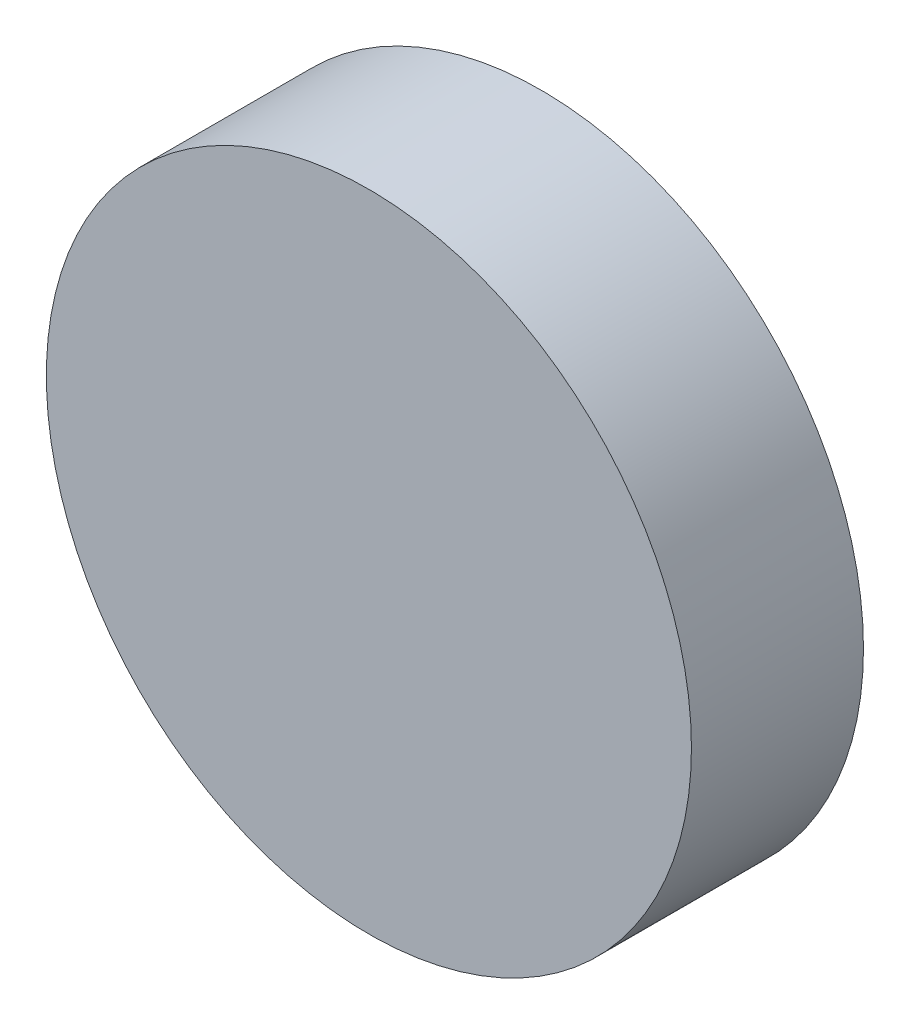
ISO-10303-21;
HEADER;
FILE_DESCRIPTION(('STEP AP214'),'2;1');
FILE_NAME('part.step','',(''),(''),'','','');
FILE_SCHEMA(('AUTOMOTIVE_DESIGN { 1 0 10303 214 1 1 1 1 }'));
ENDSEC;
DATA;
#1=APPLICATION_CONTEXT('core data for automotive mechanical design processes');
#2=APPLICATION_PROTOCOL_DEFINITION('international standard','automotive_design',2000,#1);
#3=PRODUCT_CONTEXT('',#1,'mechanical');
#4=PRODUCT('Part','Part','',(#3));
#5=PRODUCT_RELATED_PRODUCT_CATEGORY('part','',(#4));
#6=PRODUCT_DEFINITION_FORMATION('','',#4);
#7=PRODUCT_DEFINITION_CONTEXT('part definition',#1,'design');
#8=PRODUCT_DEFINITION('design','',#6,#7);
#9=PRODUCT_DEFINITION_SHAPE('','',#8);
#10=(LENGTH_UNIT() NAMED_UNIT(*) SI_UNIT(.MILLI.,.METRE.));
#11=(NAMED_UNIT(*) PLANE_ANGLE_UNIT() SI_UNIT($,.RADIAN.));
#12=(NAMED_UNIT(*) SI_UNIT($,.STERADIAN.) SOLID_ANGLE_UNIT());
#13=UNCERTAINTY_MEASURE_WITH_UNIT(LENGTH_MEASURE(1.E-05),#10,'distance_accuracy_value','');
#14=(GEOMETRIC_REPRESENTATION_CONTEXT(3) GLOBAL_UNCERTAINTY_ASSIGNED_CONTEXT((#13)) GLOBAL_UNIT_ASSIGNED_CONTEXT((#10,
#11,#12)) REPRESENTATION_CONTEXT('',''));
#15=CARTESIAN_POINT('',(0.,0.,0.));
#16=DIRECTION('',(0.,0.,1.));
#17=DIRECTION('',(1.,0.,0.));
#18=AXIS2_PLACEMENT_3D('',#15,#16,#17);
#19=CARTESIAN_POINT('',(0.,0.,0.3999992));
#20=DIRECTION('',(0.,0.,1.));
#21=DIRECTION('',(1.,0.,0.));
#22=AXIS2_PLACEMENT_3D('',#19,#20,#21);
#23=PLANE('',#22);
#24=CARTESIAN_POINT('',(0.,0.,0.3999992));
#25=DIRECTION('',(0.,0.,1.));
#26=DIRECTION('',(1.,0.,0.));
#27=AXIS2_PLACEMENT_3D('',#24,#25,#26);
#28=CIRCLE('',#27,0.75000104);
#29=CARTESIAN_POINT('',(0.75000104,0.,0.3999992));
#30=VERTEX_POINT('',#29);
#31=EDGE_CURVE('E11',#30,#30,#28,.T.);
#32=ORIENTED_EDGE('',*,*,#31,.T.);
#33=EDGE_LOOP('',(#32));
#34=FACE_BOUND('',#33,.T.);
#35=ADVANCED_FACE('F17',(#34),#23,.T.);
#36=CARTESIAN_POINT('',(0.,0.,0.));
#37=DIRECTION('',(0.,0.,1.));
#38=DIRECTION('',(1.,0.,0.));
#39=AXIS2_PLACEMENT_3D('',#36,#37,#38);
#40=PLANE('',#39);
#41=CARTESIAN_POINT('',(0.,0.,0.));
#42=DIRECTION('',(0.,0.,1.));
#43=DIRECTION('',(1.,0.,0.));
#44=AXIS2_PLACEMENT_3D('',#41,#42,#43);
#45=CIRCLE('',#44,0.75000104);
#46=CARTESIAN_POINT('',(0.75000104,0.,0.));
#47=VERTEX_POINT('',#46);
#48=EDGE_CURVE('E42',#47,#47,#45,.T.);
#49=ORIENTED_EDGE('',*,*,#48,.F.);
#50=EDGE_LOOP('',(#49));
#51=FACE_BOUND('',#50,.T.);
#52=ADVANCED_FACE('F56',(#51),#40,.F.);
#53=CARTESIAN_POINT('',(0.,0.,0.));
#54=DIRECTION('',(0.,0.,-1.));
#55=DIRECTION('',(1.,0.,0.));
#56=AXIS2_PLACEMENT_3D('',#53,#54,#55);
#57=CYLINDRICAL_SURFACE('',#56,0.75000104);
#58=ORIENTED_EDGE('',*,*,#48,.T.);
#59=DIRECTION('',(0.,0.,1.));
#60=VECTOR('',#59,1.);
#61=CARTESIAN_POINT('',(0.75000104,0.,0.));
#62=LINE('',#61,#60);
#63=EDGE_CURVE('E25',#47,#30,#62,.T.);
#64=ORIENTED_EDGE('',*,*,#63,.T.);
#65=ORIENTED_EDGE('',*,*,#31,.F.);
#66=ORIENTED_EDGE('',*,*,#63,.F.);
#67=EDGE_LOOP('',(#58,#64,#65,#66));
#68=FACE_BOUND('',#67,.T.);
#69=ADVANCED_FACE('F40',(#68),#57,.T.);
#70=CLOSED_SHELL('',(#35,#52,#69));
#71=MANIFOLD_SOLID_BREP('B1',#70);
#72=ADVANCED_BREP_SHAPE_REPRESENTATION('',(#18,#71),#14);
#73=SHAPE_DEFINITION_REPRESENTATION(#9,#72);
ENDSEC;
END-ISO-10303-21;
